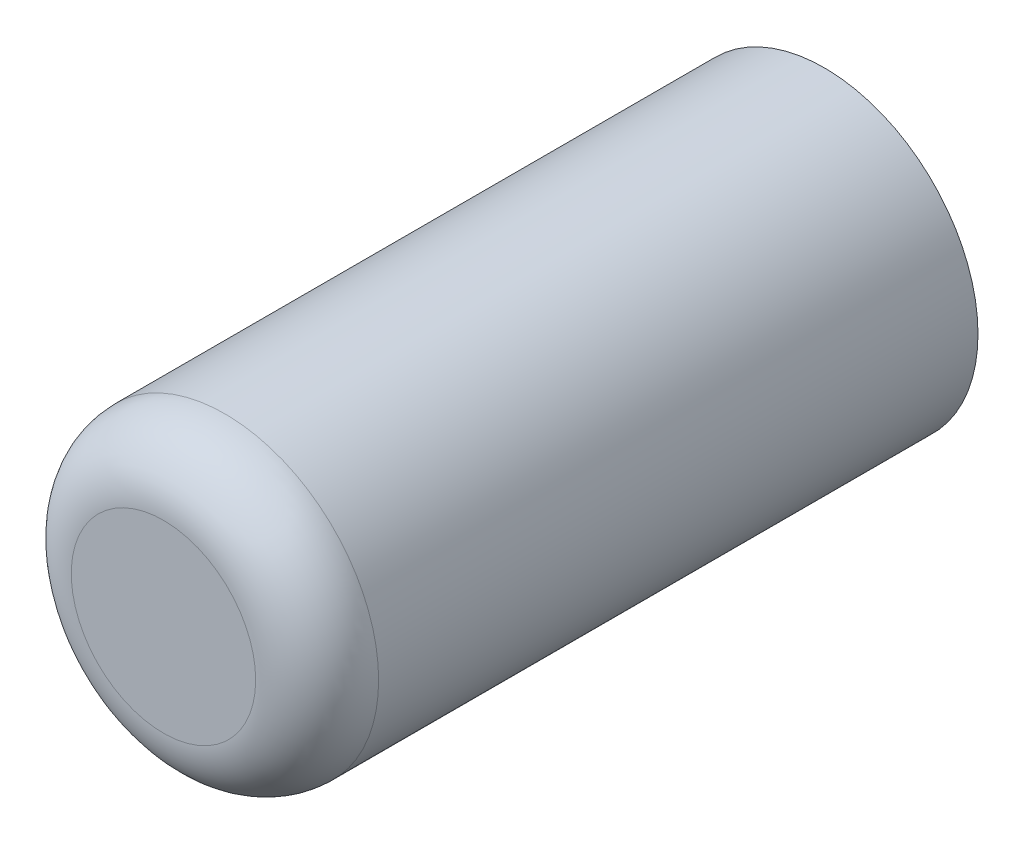
ISO-10303-21;
HEADER;
FILE_DESCRIPTION(('STEP AP214'),'2;1');
FILE_NAME('part.step','',(''),(''),'','','');
FILE_SCHEMA(('AUTOMOTIVE_DESIGN { 1 0 10303 214 1 1 1 1 }'));
ENDSEC;
DATA;
#1=APPLICATION_CONTEXT('core data for automotive mechanical design processes');
#2=APPLICATION_PROTOCOL_DEFINITION('international standard','automotive_design',2000,#1);
#3=PRODUCT_CONTEXT('',#1,'mechanical');
#4=PRODUCT('Part','Part','',(#3));
#5=PRODUCT_RELATED_PRODUCT_CATEGORY('part','',(#4));
#6=PRODUCT_DEFINITION_FORMATION('','',#4);
#7=PRODUCT_DEFINITION_CONTEXT('part definition',#1,'design');
#8=PRODUCT_DEFINITION('design','',#6,#7);
#9=PRODUCT_DEFINITION_SHAPE('','',#8);
#10=(LENGTH_UNIT() NAMED_UNIT(*) SI_UNIT(.MILLI.,.METRE.));
#11=(NAMED_UNIT(*) PLANE_ANGLE_UNIT() SI_UNIT($,.RADIAN.));
#12=(NAMED_UNIT(*) SI_UNIT($,.STERADIAN.) SOLID_ANGLE_UNIT());
#13=UNCERTAINTY_MEASURE_WITH_UNIT(LENGTH_MEASURE(1.E-05),#10,'distance_accuracy_value','');
#14=(GEOMETRIC_REPRESENTATION_CONTEXT(3) GLOBAL_UNCERTAINTY_ASSIGNED_CONTEXT((#13)) GLOBAL_UNIT_ASSIGNED_CONTEXT((#10,
#11,#12)) REPRESENTATION_CONTEXT('',''));
#15=CARTESIAN_POINT('',(0.,0.,0.));
#16=DIRECTION('',(0.,0.,1.));
#17=DIRECTION('',(1.,0.,0.));
#18=AXIS2_PLACEMENT_3D('',#15,#16,#17);
#19=CARTESIAN_POINT('',(0.,0.,11.5));
#20=DIRECTION('',(0.,0.,-1.));
#21=DIRECTION('',(-1.,0.,0.));
#22=AXIS2_PLACEMENT_3D('',#19,#20,#21);
#23=CYLINDRICAL_SURFACE('',#22,3.5);
#24=CARTESIAN_POINT('',(0.,0.,0.));
#25=DIRECTION('',(0.,0.,1.));
#26=DIRECTION('',(1.,0.,0.));
#27=AXIS2_PLACEMENT_3D('',#24,#25,#26);
#28=CIRCLE('',#27,3.5);
#29=CARTESIAN_POINT('',(-2.6809513236909,2.25,0.));
#30=VERTEX_POINT('',#29);
#31=CARTESIAN_POINT('',(2.6809513236909,2.25,0.));
#32=VERTEX_POINT('',#31);
#33=EDGE_CURVE('E78',#30,#32,#28,.T.);
#34=ORIENTED_EDGE('',*,*,#33,.F.);
#35=DIRECTION('',(0.,0.,-1.));
#36=VECTOR('',#35,1.);
#37=CARTESIAN_POINT('',(-2.6809513236909,2.25,11.5));
#38=LINE('',#37,#36);
#39=CARTESIAN_POINT('',(-2.6809513236909,2.25,11.5));
#40=VERTEX_POINT('',#39);
#41=EDGE_CURVE('E60',#40,#30,#38,.T.);
#42=ORIENTED_EDGE('',*,*,#41,.F.);
#43=CARTESIAN_POINT('',(0.,0.,11.5));
#44=DIRECTION('',(0.,0.,1.));
#45=DIRECTION('',(1.,0.,0.));
#46=AXIS2_PLACEMENT_3D('',#43,#44,#45);
#47=CIRCLE('',#46,3.5);
#48=CARTESIAN_POINT('',(2.6809513236909,2.25,11.5));
#49=VERTEX_POINT('',#48);
#50=EDGE_CURVE('E50',#40,#49,#47,.T.);
#51=ORIENTED_EDGE('',*,*,#50,.T.);
#52=DIRECTION('',(0.,0.,-1.));
#53=VECTOR('',#52,1.);
#54=CARTESIAN_POINT('',(2.6809513236909,2.25,11.5));
#55=LINE('',#54,#53);
#56=EDGE_CURVE('E65',#49,#32,#55,.T.);
#57=ORIENTED_EDGE('',*,*,#56,.T.);
#58=EDGE_LOOP('',(#34,#42,#51,#57));
#59=FACE_BOUND('',#58,.T.);
#60=ADVANCED_FACE('F35',(#59),#23,.F.);
#61=CARTESIAN_POINT('',(0.,2.25,11.5));
#62=DIRECTION('',(0.,-1.,0.));
#63=DIRECTION('',(0.,0.,-1.));
#64=AXIS2_PLACEMENT_3D('',#61,#62,#63);
#65=PLANE('',#64);
#66=DIRECTION('',(-1.,0.,0.));
#67=VECTOR('',#66,1.);
#68=CARTESIAN_POINT('',(0.,2.25,0.));
#69=LINE('',#68,#67);
#70=EDGE_CURVE('E69',#32,#30,#69,.T.);
#71=ORIENTED_EDGE('',*,*,#70,.F.);
#72=ORIENTED_EDGE('',*,*,#56,.F.);
#73=DIRECTION('',(-1.,0.,0.));
#74=VECTOR('',#73,1.);
#75=CARTESIAN_POINT('',(0.,2.25,11.5));
#76=LINE('',#75,#74);
#77=EDGE_CURVE('E62',#49,#40,#76,.T.);
#78=ORIENTED_EDGE('',*,*,#77,.T.);
#79=ORIENTED_EDGE('',*,*,#41,.T.);
#80=EDGE_LOOP('',(#71,#72,#78,#79));
#81=FACE_BOUND('',#80,.T.);
#82=ADVANCED_FACE('F67',(#81),#65,.T.);
#83=CARTESIAN_POINT('',(0.,0.,11.5));
#84=DIRECTION('',(0.,0.,-1.));
#85=DIRECTION('',(-1.,0.,0.));
#86=AXIS2_PLACEMENT_3D('',#83,#84,#85);
#87=CYLINDRICAL_SURFACE('',#86,5.);
#88=CARTESIAN_POINT('',(0.,0.,19.5));
#89=DIRECTION('',(0.,0.,1.));
#90=DIRECTION('',(1.,0.,0.));
#91=AXIS2_PLACEMENT_3D('',#88,#89,#90);
#92=CIRCLE('',#91,5.);
#93=CARTESIAN_POINT('',(5.,0.,19.5));
#94=VERTEX_POINT('',#93);
#95=EDGE_CURVE('E11',#94,#94,#92,.F.);
#96=ORIENTED_EDGE('',*,*,#95,.T.);
#97=EDGE_LOOP('',(#96));
#98=FACE_BOUND('',#97,.T.);
#99=CARTESIAN_POINT('',(0.,0.,0.));
#100=DIRECTION('',(0.,0.,1.));
#101=DIRECTION('',(1.,0.,0.));
#102=AXIS2_PLACEMENT_3D('',#99,#100,#101);
#103=CIRCLE('',#102,5.);
#104=CARTESIAN_POINT('',(5.,0.,0.));
#105=VERTEX_POINT('',#104);
#106=EDGE_CURVE('E73',#105,#105,#103,.T.);
#107=ORIENTED_EDGE('',*,*,#106,.T.);
#108=EDGE_LOOP('',(#107));
#109=FACE_BOUND('',#108,.T.);
#110=ADVANCED_FACE('F97',(#98,#109),#87,.T.);
#111=CARTESIAN_POINT('',(0.,0.,0.));
#112=DIRECTION('',(0.,0.,1.));
#113=DIRECTION('',(1.,0.,0.));
#114=AXIS2_PLACEMENT_3D('',#111,#112,#113);
#115=PLANE('',#114);
#116=ORIENTED_EDGE('',*,*,#33,.T.);
#117=ORIENTED_EDGE('',*,*,#70,.T.);
#118=EDGE_LOOP('',(#116,#117));
#119=FACE_BOUND('',#118,.T.);
#120=ORIENTED_EDGE('',*,*,#106,.F.);
#121=EDGE_LOOP('',(#120));
#122=FACE_BOUND('',#121,.T.);
#123=ADVANCED_FACE('F102',(#119,#122),#115,.F.);
#124=CARTESIAN_POINT('',(0.,0.,11.5));
#125=DIRECTION('',(0.,0.,1.));
#126=DIRECTION('',(1.,0.,0.));
#127=AXIS2_PLACEMENT_3D('',#124,#125,#126);
#128=PLANE('',#127);
#129=ORIENTED_EDGE('',*,*,#50,.F.);
#130=ORIENTED_EDGE('',*,*,#77,.F.);
#131=EDGE_LOOP('',(#129,#130));
#132=FACE_BOUND('',#131,.T.);
#133=ADVANCED_FACE('F64',(#132),#128,.F.);
#134=CARTESIAN_POINT('',(0.,0.,21.5));
#135=DIRECTION('',(0.,0.,1.));
#136=DIRECTION('',(1.,0.,0.));
#137=AXIS2_PLACEMENT_3D('',#134,#135,#136);
#138=PLANE('',#137);
#139=CARTESIAN_POINT('',(0.,0.,21.5));
#140=DIRECTION('',(0.,0.,1.));
#141=DIRECTION('',(1.,0.,0.));
#142=AXIS2_PLACEMENT_3D('',#139,#140,#141);
#143=CIRCLE('',#142,3.);
#144=CARTESIAN_POINT('',(3.,0.,21.5));
#145=VERTEX_POINT('',#144);
#146=EDGE_CURVE('E44',#145,#145,#143,.T.);
#147=ORIENTED_EDGE('',*,*,#146,.T.);
#148=EDGE_LOOP('',(#147));
#149=FACE_BOUND('',#148,.T.);
#150=ADVANCED_FACE('F84',(#149),#138,.T.);
#151=CARTESIAN_POINT('',(0.,0.,19.5));
#152=DIRECTION('',(0.,0.,1.));
#153=DIRECTION('',(1.,0.,0.));
#154=AXIS2_PLACEMENT_3D('',#151,#152,#153);
#155=TOROIDAL_SURFACE('',#154,3.,2.);
#156=ORIENTED_EDGE('',*,*,#95,.F.);
#157=EDGE_LOOP('',(#156));
#158=FACE_BOUND('',#157,.T.);
#159=ORIENTED_EDGE('',*,*,#146,.F.);
#160=EDGE_LOOP('',(#159));
#161=FACE_BOUND('',#160,.T.);
#162=ADVANCED_FACE('F37',(#158,#161),#155,.T.);
#163=CLOSED_SHELL('',(#60,#82,#110,#123,#133,#150,#162));
#164=MANIFOLD_SOLID_BREP('B2',#163);
#165=ADVANCED_BREP_SHAPE_REPRESENTATION('',(#18,#164),#14);
#166=SHAPE_DEFINITION_REPRESENTATION(#9,#165);
ENDSEC;
END-ISO-10303-21;
